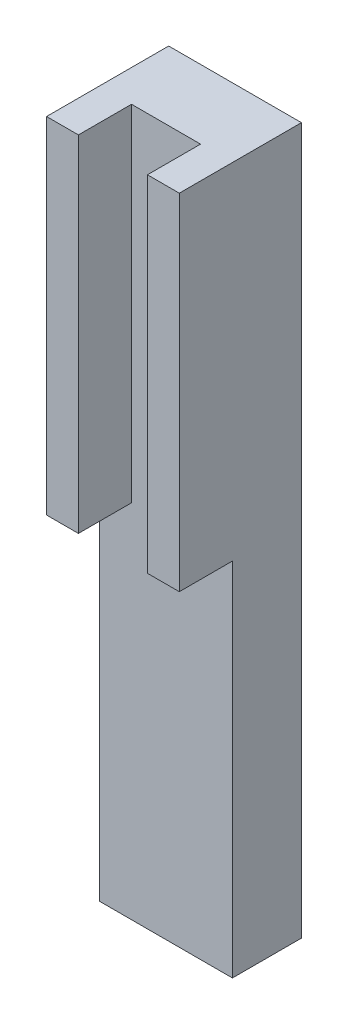
ISO-10303-21;
HEADER;
FILE_DESCRIPTION(('STEP AP214'),'2;1');
FILE_NAME('part.step','',(''),(''),'','','');
FILE_SCHEMA(('AUTOMOTIVE_DESIGN { 1 0 10303 214 1 1 1 1 }'));
ENDSEC;
DATA;
#1=APPLICATION_CONTEXT('core data for automotive mechanical design processes');
#2=APPLICATION_PROTOCOL_DEFINITION('international standard','automotive_design',2000,#1);
#3=PRODUCT_CONTEXT('',#1,'mechanical');
#4=PRODUCT('Part','Part','',(#3));
#5=PRODUCT_RELATED_PRODUCT_CATEGORY('part','',(#4));
#6=PRODUCT_DEFINITION_FORMATION('','',#4);
#7=PRODUCT_DEFINITION_CONTEXT('part definition',#1,'design');
#8=PRODUCT_DEFINITION('design','',#6,#7);
#9=PRODUCT_DEFINITION_SHAPE('','',#8);
#10=(LENGTH_UNIT() NAMED_UNIT(*) SI_UNIT(.MILLI.,.METRE.));
#11=(NAMED_UNIT(*) PLANE_ANGLE_UNIT() SI_UNIT($,.RADIAN.));
#12=(NAMED_UNIT(*) SI_UNIT($,.STERADIAN.) SOLID_ANGLE_UNIT());
#13=UNCERTAINTY_MEASURE_WITH_UNIT(LENGTH_MEASURE(1.E-05),#10,'distance_accuracy_value','');
#14=(GEOMETRIC_REPRESENTATION_CONTEXT(3) GLOBAL_UNCERTAINTY_ASSIGNED_CONTEXT((#13)) GLOBAL_UNIT_ASSIGNED_CONTEXT((#10,
#11,#12)) REPRESENTATION_CONTEXT('',''));
#15=CARTESIAN_POINT('',(0.,0.,0.));
#16=DIRECTION('',(0.,0.,1.));
#17=DIRECTION('',(1.,0.,0.));
#18=AXIS2_PLACEMENT_3D('',#15,#16,#17);
#19=CARTESIAN_POINT('',(0.,0.,22.9997));
#20=DIRECTION('',(0.,0.,-1.));
#21=DIRECTION('',(-1.,0.,0.));
#22=AXIS2_PLACEMENT_3D('',#19,#20,#21);
#23=PLANE('',#22);
#24=DIRECTION('',(-1.,0.,0.));
#25=VECTOR('',#24,1.);
#26=CARTESIAN_POINT('',(0.,68.00088,22.9997));
#27=LINE('',#26,#25);
#28=CARTESIAN_POINT('',(5.99948,68.00088,22.9997));
#29=VERTEX_POINT('',#28);
#30=CARTESIAN_POINT('',(0.,68.00088,22.9997));
#31=VERTEX_POINT('',#30);
#32=EDGE_CURVE('E138',#29,#31,#27,.T.);
#33=ORIENTED_EDGE('',*,*,#32,.F.);
#34=DIRECTION('',(0.,-1.,0.));
#35=VECTOR('',#34,1.);
#36=CARTESIAN_POINT('',(5.99948,68.00088,22.9997));
#37=LINE('',#36,#35);
#38=CARTESIAN_POINT('',(5.99948,132.99948,22.9997));
#39=VERTEX_POINT('',#38);
#40=EDGE_CURVE('E119',#39,#29,#37,.T.);
#41=ORIENTED_EDGE('',*,*,#40,.F.);
#42=DIRECTION('',(-1.,0.,0.));
#43=VECTOR('',#42,1.);
#44=CARTESIAN_POINT('',(0.,132.99948,22.9997));
#45=LINE('',#44,#43);
#46=CARTESIAN_POINT('',(0.,132.99948,22.9997));
#47=VERTEX_POINT('',#46);
#48=EDGE_CURVE('E146',#39,#47,#45,.T.);
#49=ORIENTED_EDGE('',*,*,#48,.T.);
#50=DIRECTION('',(0.,-1.,0.));
#51=VECTOR('',#50,1.);
#52=CARTESIAN_POINT('',(0.,0.,22.9997));
#53=LINE('',#52,#51);
#54=EDGE_CURVE('E151',#47,#31,#53,.T.);
#55=ORIENTED_EDGE('',*,*,#54,.T.);
#56=EDGE_LOOP('',(#33,#41,#49,#55));
#57=FACE_BOUND('',#56,.T.);
#58=ADVANCED_FACE('F33',(#57),#23,.F.);
#59=CARTESIAN_POINT('',(0.,68.00088,12.99972));
#60=DIRECTION('',(0.,1.,0.));
#61=DIRECTION('',(0.,0.,1.));
#62=AXIS2_PLACEMENT_3D('',#59,#60,#61);
#63=PLANE('',#62);
#64=DIRECTION('',(-1.,0.,0.));
#65=VECTOR('',#64,1.);
#66=CARTESIAN_POINT('',(0.,68.00088,12.99972));
#67=LINE('',#66,#65);
#68=CARTESIAN_POINT('',(5.99948,68.00088,12.99972));
#69=VERTEX_POINT('',#68);
#70=CARTESIAN_POINT('',(0.,68.00088,12.99972));
#71=VERTEX_POINT('',#70);
#72=EDGE_CURVE('E130',#69,#71,#67,.T.);
#73=ORIENTED_EDGE('',*,*,#72,.F.);
#74=DIRECTION('',(0.,0.,1.));
#75=VECTOR('',#74,1.);
#76=CARTESIAN_POINT('',(5.99948,68.00088,12.99972));
#77=LINE('',#76,#75);
#78=EDGE_CURVE('E198',#69,#29,#77,.T.);
#79=ORIENTED_EDGE('',*,*,#78,.T.);
#80=ORIENTED_EDGE('',*,*,#32,.T.);
#81=DIRECTION('',(0.,0.,1.));
#82=VECTOR('',#81,1.);
#83=CARTESIAN_POINT('',(0.,68.00088,12.99972));
#84=LINE('',#83,#82);
#85=EDGE_CURVE('E139',#71,#31,#84,.T.);
#86=ORIENTED_EDGE('',*,*,#85,.F.);
#87=EDGE_LOOP('',(#73,#79,#80,#86));
#88=FACE_BOUND('',#87,.T.);
#89=ADVANCED_FACE('F206',(#88),#63,.F.);
#90=CARTESIAN_POINT('',(25.00122,0.,22.9997));
#91=DIRECTION('',(0.,1.,0.));
#92=DIRECTION('',(-1.,0.,0.));
#93=AXIS2_PLACEMENT_3D('',#90,#91,#92);
#94=PLANE('',#93);
#95=DIRECTION('',(0.,0.,-1.));
#96=VECTOR('',#95,1.);
#97=CARTESIAN_POINT('',(25.00122,0.,22.9997));
#98=LINE('',#97,#96);
#99=CARTESIAN_POINT('',(25.00122,0.,12.99972));
#100=VERTEX_POINT('',#99);
#101=CARTESIAN_POINT('',(25.00122,0.,0.));
#102=VERTEX_POINT('',#101);
#103=EDGE_CURVE('E11',#100,#102,#98,.T.);
#104=ORIENTED_EDGE('',*,*,#103,.F.);
#105=DIRECTION('',(1.,0.,0.));
#106=VECTOR('',#105,1.);
#107=CARTESIAN_POINT('',(25.00122,0.,12.99972));
#108=LINE('',#107,#106);
#109=CARTESIAN_POINT('',(0.,0.,12.99972));
#110=VERTEX_POINT('',#109);
#111=EDGE_CURVE('E137',#110,#100,#108,.T.);
#112=ORIENTED_EDGE('',*,*,#111,.F.);
#113=DIRECTION('',(0.,0.,-1.));
#114=VECTOR('',#113,1.);
#115=CARTESIAN_POINT('',(0.,0.,22.9997));
#116=LINE('',#115,#114);
#117=CARTESIAN_POINT('',(0.,0.,0.));
#118=VERTEX_POINT('',#117);
#119=EDGE_CURVE('E154',#110,#118,#116,.T.);
#120=ORIENTED_EDGE('',*,*,#119,.T.);
#121=DIRECTION('',(1.,0.,0.));
#122=VECTOR('',#121,1.);
#123=CARTESIAN_POINT('',(25.00122,0.,0.));
#124=LINE('',#123,#122);
#125=EDGE_CURVE('E142',#118,#102,#124,.T.);
#126=ORIENTED_EDGE('',*,*,#125,.T.);
#127=EDGE_LOOP('',(#104,#112,#120,#126));
#128=FACE_BOUND('',#127,.T.);
#129=ADVANCED_FACE('F35',(#128),#94,.F.);
#130=CARTESIAN_POINT('',(25.00122,132.99948,22.9997));
#131=DIRECTION('',(-1.,0.,0.));
#132=DIRECTION('',(0.,-1.,0.));
#133=AXIS2_PLACEMENT_3D('',#130,#131,#132);
#134=PLANE('',#133);
#135=DIRECTION('',(0.,1.,0.));
#136=VECTOR('',#135,1.);
#137=CARTESIAN_POINT('',(25.00122,132.99948,22.9997));
#138=LINE('',#137,#136);
#139=CARTESIAN_POINT('',(25.00122,68.00088,22.9997));
#140=VERTEX_POINT('',#139);
#141=CARTESIAN_POINT('',(25.00122,132.99948,22.9997));
#142=VERTEX_POINT('',#141);
#143=EDGE_CURVE('E144',#140,#142,#138,.T.);
#144=ORIENTED_EDGE('',*,*,#143,.F.);
#145=DIRECTION('',(0.,0.,1.));
#146=VECTOR('',#145,1.);
#147=CARTESIAN_POINT('',(25.00122,68.00088,12.99972));
#148=LINE('',#147,#146);
#149=CARTESIAN_POINT('',(25.00122,68.00088,12.99972));
#150=VERTEX_POINT('',#149);
#151=EDGE_CURVE('E56',#150,#140,#148,.T.);
#152=ORIENTED_EDGE('',*,*,#151,.F.);
#153=DIRECTION('',(0.,1.,0.));
#154=VECTOR('',#153,1.);
#155=CARTESIAN_POINT('',(25.00122,68.00088,12.99972));
#156=LINE('',#155,#154);
#157=EDGE_CURVE('E128',#100,#150,#156,.T.);
#158=ORIENTED_EDGE('',*,*,#157,.F.);
#159=ORIENTED_EDGE('',*,*,#103,.T.);
#160=DIRECTION('',(0.,1.,0.));
#161=VECTOR('',#160,1.);
#162=CARTESIAN_POINT('',(25.00122,132.99948,0.));
#163=LINE('',#162,#161);
#164=CARTESIAN_POINT('',(25.00122,132.99948,0.));
#165=VERTEX_POINT('',#164);
#166=EDGE_CURVE('E157',#102,#165,#163,.T.);
#167=ORIENTED_EDGE('',*,*,#166,.T.);
#168=DIRECTION('',(0.,0.,-1.));
#169=VECTOR('',#168,1.);
#170=CARTESIAN_POINT('',(25.00122,132.99948,22.9997));
#171=LINE('',#170,#169);
#172=EDGE_CURVE('E41',#142,#165,#171,.T.);
#173=ORIENTED_EDGE('',*,*,#172,.F.);
#174=EDGE_LOOP('',(#144,#152,#158,#159,#167,#173));
#175=FACE_BOUND('',#174,.T.);
#176=ADVANCED_FACE('F204',(#175),#134,.F.);
#177=CARTESIAN_POINT('',(0.,132.99948,22.9997));
#178=DIRECTION('',(0.,-1.,0.));
#179=DIRECTION('',(0.,0.,-1.));
#180=AXIS2_PLACEMENT_3D('',#177,#178,#179);
#181=PLANE('',#180);
#182=ORIENTED_EDGE('',*,*,#48,.F.);
#183=DIRECTION('',(0.,0.,1.));
#184=VECTOR('',#183,1.);
#185=CARTESIAN_POINT('',(5.99948,132.99948,12.99972));
#186=LINE('',#185,#184);
#187=CARTESIAN_POINT('',(5.99948,132.99948,12.99972));
#188=VERTEX_POINT('',#187);
#189=EDGE_CURVE('E187',#188,#39,#186,.T.);
#190=ORIENTED_EDGE('',*,*,#189,.F.);
#191=DIRECTION('',(-1.,0.,0.));
#192=VECTOR('',#191,1.);
#193=CARTESIAN_POINT('',(5.99948,132.99948,12.99972));
#194=LINE('',#193,#192);
#195=CARTESIAN_POINT('',(19.00174,132.99948,12.99972));
#196=VERTEX_POINT('',#195);
#197=EDGE_CURVE('E118',#196,#188,#194,.T.);
#198=ORIENTED_EDGE('',*,*,#197,.F.);
#199=DIRECTION('',(0.,0.,1.));
#200=VECTOR('',#199,1.);
#201=CARTESIAN_POINT('',(19.00174,132.99948,12.99972));
#202=LINE('',#201,#200);
#203=CARTESIAN_POINT('',(19.00174,132.99948,22.9997));
#204=VERTEX_POINT('',#203);
#205=EDGE_CURVE('E115',#196,#204,#202,.T.);
#206=ORIENTED_EDGE('',*,*,#205,.T.);
#207=EDGE_CURVE('E148',#142,#204,#45,.T.);
#208=ORIENTED_EDGE('',*,*,#207,.F.);
#209=ORIENTED_EDGE('',*,*,#172,.T.);
#210=DIRECTION('',(-1.,0.,0.));
#211=VECTOR('',#210,1.);
#212=CARTESIAN_POINT('',(0.,132.99948,0.));
#213=LINE('',#212,#211);
#214=CARTESIAN_POINT('',(0.,132.99948,0.));
#215=VERTEX_POINT('',#214);
#216=EDGE_CURVE('E159',#165,#215,#213,.T.);
#217=ORIENTED_EDGE('',*,*,#216,.T.);
#218=DIRECTION('',(0.,0.,-1.));
#219=VECTOR('',#218,1.);
#220=CARTESIAN_POINT('',(0.,132.99948,22.9997));
#221=LINE('',#220,#219);
#222=EDGE_CURVE('E164',#47,#215,#221,.T.);
#223=ORIENTED_EDGE('',*,*,#222,.F.);
#224=EDGE_LOOP('',(#182,#190,#198,#206,#208,#209,#217,#223));
#225=FACE_BOUND('',#224,.T.);
#226=ADVANCED_FACE('F172',(#225),#181,.F.);
#227=CARTESIAN_POINT('',(0.,0.,22.9997));
#228=DIRECTION('',(1.,0.,0.));
#229=DIRECTION('',(0.,0.,-1.));
#230=AXIS2_PLACEMENT_3D('',#227,#228,#229);
#231=PLANE('',#230);
#232=DIRECTION('',(0.,-1.,0.));
#233=VECTOR('',#232,1.);
#234=CARTESIAN_POINT('',(0.,0.,12.99972));
#235=LINE('',#234,#233);
#236=EDGE_CURVE('E129',#71,#110,#235,.T.);
#237=ORIENTED_EDGE('',*,*,#236,.F.);
#238=ORIENTED_EDGE('',*,*,#85,.T.);
#239=ORIENTED_EDGE('',*,*,#54,.F.);
#240=ORIENTED_EDGE('',*,*,#222,.T.);
#241=DIRECTION('',(0.,-1.,0.));
#242=VECTOR('',#241,1.);
#243=CARTESIAN_POINT('',(0.,0.,0.));
#244=LINE('',#243,#242);
#245=EDGE_CURVE('E147',#215,#118,#244,.T.);
#246=ORIENTED_EDGE('',*,*,#245,.T.);
#247=ORIENTED_EDGE('',*,*,#119,.F.);
#248=EDGE_LOOP('',(#237,#238,#239,#240,#246,#247));
#249=FACE_BOUND('',#248,.T.);
#250=ADVANCED_FACE('F184',(#249),#231,.F.);
#251=ORIENTED_EDGE('',*,*,#207,.T.);
#252=DIRECTION('',(0.,1.,0.));
#253=VECTOR('',#252,1.);
#254=CARTESIAN_POINT('',(19.00174,132.99948,22.9997));
#255=LINE('',#254,#253);
#256=CARTESIAN_POINT('',(19.00174,68.00088,22.9997));
#257=VERTEX_POINT('',#256);
#258=EDGE_CURVE('E193',#257,#204,#255,.T.);
#259=ORIENTED_EDGE('',*,*,#258,.F.);
#260=EDGE_CURVE('E124',#140,#257,#27,.T.);
#261=ORIENTED_EDGE('',*,*,#260,.F.);
#262=ORIENTED_EDGE('',*,*,#143,.T.);
#263=EDGE_LOOP('',(#251,#259,#261,#262));
#264=FACE_BOUND('',#263,.T.);
#265=ADVANCED_FACE('F215',(#264),#23,.F.);
#266=CARTESIAN_POINT('',(0.,0.,0.));
#267=DIRECTION('',(0.,0.,-1.));
#268=DIRECTION('',(-1.,0.,0.));
#269=AXIS2_PLACEMENT_3D('',#266,#267,#268);
#270=PLANE('',#269);
#271=ORIENTED_EDGE('',*,*,#125,.F.);
#272=ORIENTED_EDGE('',*,*,#245,.F.);
#273=ORIENTED_EDGE('',*,*,#216,.F.);
#274=ORIENTED_EDGE('',*,*,#166,.F.);
#275=EDGE_LOOP('',(#271,#272,#273,#274));
#276=FACE_BOUND('',#275,.T.);
#277=ADVANCED_FACE('F180',(#276),#270,.T.);
#278=ORIENTED_EDGE('',*,*,#260,.T.);
#279=DIRECTION('',(0.,0.,1.));
#280=VECTOR('',#279,1.);
#281=CARTESIAN_POINT('',(19.00174,68.00088,12.99972));
#282=LINE('',#281,#280);
#283=CARTESIAN_POINT('',(19.00174,68.00088,12.99972));
#284=VERTEX_POINT('',#283);
#285=EDGE_CURVE('E112',#284,#257,#282,.T.);
#286=ORIENTED_EDGE('',*,*,#285,.F.);
#287=EDGE_CURVE('E122',#150,#284,#67,.T.);
#288=ORIENTED_EDGE('',*,*,#287,.F.);
#289=ORIENTED_EDGE('',*,*,#151,.T.);
#290=EDGE_LOOP('',(#278,#286,#288,#289));
#291=FACE_BOUND('',#290,.T.);
#292=ADVANCED_FACE('F121',(#291),#63,.F.);
#293=CARTESIAN_POINT('',(0.,0.,12.99972));
#294=DIRECTION('',(0.,0.,-1.));
#295=DIRECTION('',(-1.,0.,0.));
#296=AXIS2_PLACEMENT_3D('',#293,#294,#295);
#297=PLANE('',#296);
#298=ORIENTED_EDGE('',*,*,#111,.T.);
#299=ORIENTED_EDGE('',*,*,#157,.T.);
#300=ORIENTED_EDGE('',*,*,#287,.T.);
#301=DIRECTION('',(0.,1.,0.));
#302=VECTOR('',#301,1.);
#303=CARTESIAN_POINT('',(19.00174,132.99948,12.99972));
#304=LINE('',#303,#302);
#305=EDGE_CURVE('E109',#284,#196,#304,.T.);
#306=ORIENTED_EDGE('',*,*,#305,.T.);
#307=ORIENTED_EDGE('',*,*,#197,.T.);
#308=DIRECTION('',(0.,-1.,0.));
#309=VECTOR('',#308,1.);
#310=CARTESIAN_POINT('',(5.99948,68.00088,12.99972));
#311=LINE('',#310,#309);
#312=EDGE_CURVE('E48',#188,#69,#311,.T.);
#313=ORIENTED_EDGE('',*,*,#312,.T.);
#314=ORIENTED_EDGE('',*,*,#72,.T.);
#315=ORIENTED_EDGE('',*,*,#236,.T.);
#316=EDGE_LOOP('',(#298,#299,#300,#306,#307,#313,#314,#315));
#317=FACE_BOUND('',#316,.T.);
#318=ADVANCED_FACE('F126',(#317),#297,.F.);
#319=CARTESIAN_POINT('',(5.99948,68.00088,12.99972));
#320=DIRECTION('',(-1.,0.,0.));
#321=DIRECTION('',(0.,-1.,0.));
#322=AXIS2_PLACEMENT_3D('',#319,#320,#321);
#323=PLANE('',#322);
#324=ORIENTED_EDGE('',*,*,#40,.T.);
#325=ORIENTED_EDGE('',*,*,#78,.F.);
#326=ORIENTED_EDGE('',*,*,#312,.F.);
#327=ORIENTED_EDGE('',*,*,#189,.T.);
#328=EDGE_LOOP('',(#324,#325,#326,#327));
#329=FACE_BOUND('',#328,.T.);
#330=ADVANCED_FACE('F227',(#329),#323,.F.);
#331=CARTESIAN_POINT('',(19.00174,132.99948,12.99972));
#332=DIRECTION('',(1.,0.,0.));
#333=DIRECTION('',(0.,1.,0.));
#334=AXIS2_PLACEMENT_3D('',#331,#332,#333);
#335=PLANE('',#334);
#336=ORIENTED_EDGE('',*,*,#258,.T.);
#337=ORIENTED_EDGE('',*,*,#205,.F.);
#338=ORIENTED_EDGE('',*,*,#305,.F.);
#339=ORIENTED_EDGE('',*,*,#285,.T.);
#340=EDGE_LOOP('',(#336,#337,#338,#339));
#341=FACE_BOUND('',#340,.T.);
#342=ADVANCED_FACE('F111',(#341),#335,.F.);
#343=CLOSED_SHELL('',(#58,#89,#129,#176,#226,#250,#265,#277,#292,#318,#330,#342));
#344=MANIFOLD_SOLID_BREP('B2',#343);
#345=ADVANCED_BREP_SHAPE_REPRESENTATION('',(#18,#344),#14);
#346=SHAPE_DEFINITION_REPRESENTATION(#9,#345);
ENDSEC;
END-ISO-10303-21;
